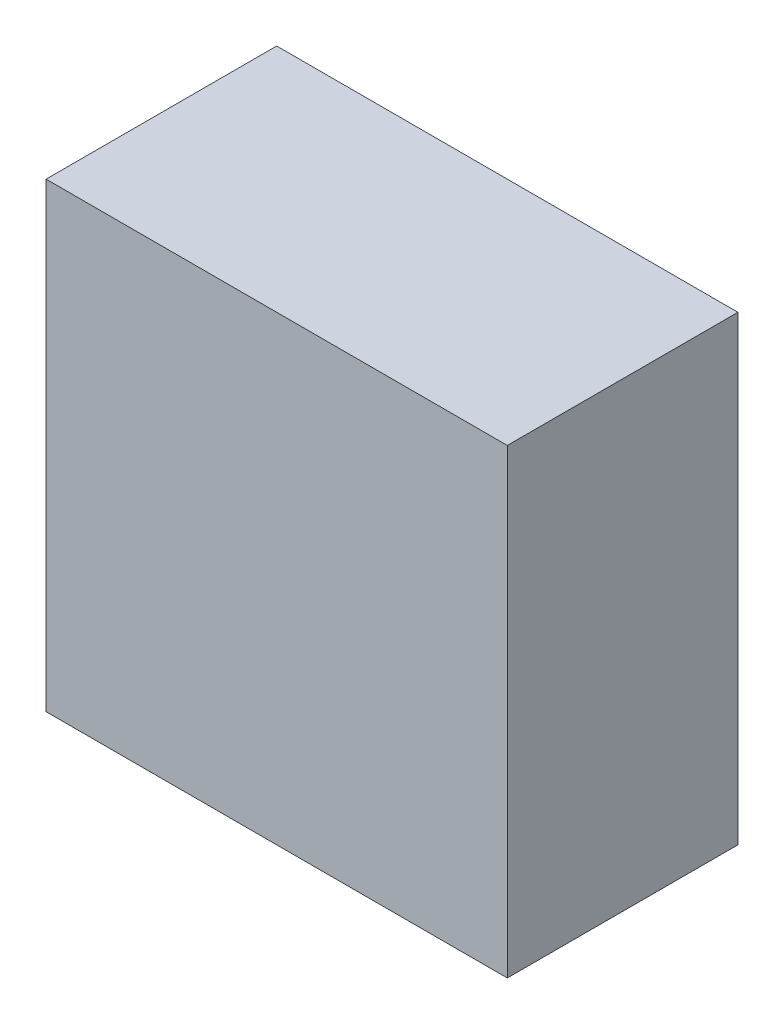
ISO-10303-21;
HEADER;
FILE_DESCRIPTION(('STEP AP214'),'2;1');
FILE_NAME('part.step','',(''),(''),'','','');
FILE_SCHEMA(('AUTOMOTIVE_DESIGN { 1 0 10303 214 1 1 1 1 }'));
ENDSEC;
DATA;
#1=APPLICATION_CONTEXT('core data for automotive mechanical design processes');
#2=APPLICATION_PROTOCOL_DEFINITION('international standard','automotive_design',2000,#1);
#3=PRODUCT_CONTEXT('',#1,'mechanical');
#4=PRODUCT('Part','Part','',(#3));
#5=PRODUCT_RELATED_PRODUCT_CATEGORY('part','',(#4));
#6=PRODUCT_DEFINITION_FORMATION('','',#4);
#7=PRODUCT_DEFINITION_CONTEXT('part definition',#1,'design');
#8=PRODUCT_DEFINITION('design','',#6,#7);
#9=PRODUCT_DEFINITION_SHAPE('','',#8);
#10=(LENGTH_UNIT() NAMED_UNIT(*) SI_UNIT(.MILLI.,.METRE.));
#11=(NAMED_UNIT(*) PLANE_ANGLE_UNIT() SI_UNIT($,.RADIAN.));
#12=(NAMED_UNIT(*) SI_UNIT($,.STERADIAN.) SOLID_ANGLE_UNIT());
#13=UNCERTAINTY_MEASURE_WITH_UNIT(LENGTH_MEASURE(1.E-05),#10,'distance_accuracy_value','');
#14=(GEOMETRIC_REPRESENTATION_CONTEXT(3) GLOBAL_UNCERTAINTY_ASSIGNED_CONTEXT((#13)) GLOBAL_UNIT_ASSIGNED_CONTEXT((#10,
#11,#12)) REPRESENTATION_CONTEXT('',''));
#15=CARTESIAN_POINT('',(0.,0.,0.));
#16=DIRECTION('',(0.,0.,1.));
#17=DIRECTION('',(1.,0.,0.));
#18=AXIS2_PLACEMENT_3D('',#15,#16,#17);
#19=CARTESIAN_POINT('',(0.,0.,1524.));
#20=DIRECTION('',(1.,0.,0.));
#21=DIRECTION('',(0.,0.,-1.));
#22=AXIS2_PLACEMENT_3D('',#19,#20,#21);
#23=PLANE('',#22);
#24=DIRECTION('',(0.,-1.,0.));
#25=VECTOR('',#24,1.);
#26=CARTESIAN_POINT('',(0.,0.,0.));
#27=LINE('',#26,#25);
#28=CARTESIAN_POINT('',(0.,3048.,0.));
#29=VERTEX_POINT('',#28);
#30=CARTESIAN_POINT('',(0.,0.,0.));
#31=VERTEX_POINT('',#30);
#32=EDGE_CURVE('E100',#29,#31,#27,.T.);
#33=ORIENTED_EDGE('',*,*,#32,.T.);
#34=DIRECTION('',(0.,0.,-1.));
#35=VECTOR('',#34,1.);
#36=CARTESIAN_POINT('',(0.,0.,1524.));
#37=LINE('',#36,#35);
#38=CARTESIAN_POINT('',(0.,0.,1524.));
#39=VERTEX_POINT('',#38);
#40=EDGE_CURVE('E11',#39,#31,#37,.T.);
#41=ORIENTED_EDGE('',*,*,#40,.F.);
#42=DIRECTION('',(0.,-1.,0.));
#43=VECTOR('',#42,1.);
#44=CARTESIAN_POINT('',(0.,0.,1524.));
#45=LINE('',#44,#43);
#46=CARTESIAN_POINT('',(0.,3048.,1524.));
#47=VERTEX_POINT('',#46);
#48=EDGE_CURVE('E88',#47,#39,#45,.T.);
#49=ORIENTED_EDGE('',*,*,#48,.F.);
#50=DIRECTION('',(0.,0.,-1.));
#51=VECTOR('',#50,1.);
#52=CARTESIAN_POINT('',(0.,3048.,1524.));
#53=LINE('',#52,#51);
#54=EDGE_CURVE('E96',#47,#29,#53,.T.);
#55=ORIENTED_EDGE('',*,*,#54,.T.);
#56=EDGE_LOOP('',(#33,#41,#49,#55));
#57=FACE_BOUND('',#56,.T.);
#58=ADVANCED_FACE('F37',(#57),#23,.F.);
#59=CARTESIAN_POINT('',(0.,0.,1524.));
#60=DIRECTION('',(0.,1.,0.));
#61=DIRECTION('',(0.,0.,1.));
#62=AXIS2_PLACEMENT_3D('',#59,#60,#61);
#63=PLANE('',#62);
#64=DIRECTION('',(1.,0.,0.));
#65=VECTOR('',#64,1.);
#66=CARTESIAN_POINT('',(0.,0.,0.));
#67=LINE('',#66,#65);
#68=CARTESIAN_POINT('',(3048.,0.,0.));
#69=VERTEX_POINT('',#68);
#70=EDGE_CURVE('E92',#31,#69,#67,.T.);
#71=ORIENTED_EDGE('',*,*,#70,.T.);
#72=DIRECTION('',(0.,0.,-1.));
#73=VECTOR('',#72,1.);
#74=CARTESIAN_POINT('',(3048.,0.,1524.));
#75=LINE('',#74,#73);
#76=CARTESIAN_POINT('',(3048.,0.,1524.));
#77=VERTEX_POINT('',#76);
#78=EDGE_CURVE('E45',#77,#69,#75,.T.);
#79=ORIENTED_EDGE('',*,*,#78,.F.);
#80=DIRECTION('',(1.,0.,0.));
#81=VECTOR('',#80,1.);
#82=CARTESIAN_POINT('',(0.,0.,1524.));
#83=LINE('',#82,#81);
#84=EDGE_CURVE('E83',#39,#77,#83,.T.);
#85=ORIENTED_EDGE('',*,*,#84,.F.);
#86=ORIENTED_EDGE('',*,*,#40,.T.);
#87=EDGE_LOOP('',(#71,#79,#85,#86));
#88=FACE_BOUND('',#87,.T.);
#89=ADVANCED_FACE('F91',(#88),#63,.F.);
#90=CARTESIAN_POINT('',(3048.,0.,1524.));
#91=DIRECTION('',(-1.,0.,0.));
#92=DIRECTION('',(0.,0.,1.));
#93=AXIS2_PLACEMENT_3D('',#90,#91,#92);
#94=PLANE('',#93);
#95=DIRECTION('',(0.,1.,0.));
#96=VECTOR('',#95,1.);
#97=CARTESIAN_POINT('',(3048.,0.,0.));
#98=LINE('',#97,#96);
#99=CARTESIAN_POINT('',(3048.,3048.,0.));
#100=VERTEX_POINT('',#99);
#101=EDGE_CURVE('E70',#69,#100,#98,.T.);
#102=ORIENTED_EDGE('',*,*,#101,.T.);
#103=DIRECTION('',(0.,0.,-1.));
#104=VECTOR('',#103,1.);
#105=CARTESIAN_POINT('',(3048.,3048.,1524.));
#106=LINE('',#105,#104);
#107=CARTESIAN_POINT('',(3048.,3048.,1524.));
#108=VERTEX_POINT('',#107);
#109=EDGE_CURVE('E93',#108,#100,#106,.T.);
#110=ORIENTED_EDGE('',*,*,#109,.F.);
#111=DIRECTION('',(0.,1.,0.));
#112=VECTOR('',#111,1.);
#113=CARTESIAN_POINT('',(3048.,0.,1524.));
#114=LINE('',#113,#112);
#115=EDGE_CURVE('E86',#77,#108,#114,.T.);
#116=ORIENTED_EDGE('',*,*,#115,.F.);
#117=ORIENTED_EDGE('',*,*,#78,.T.);
#118=EDGE_LOOP('',(#102,#110,#116,#117));
#119=FACE_BOUND('',#118,.T.);
#120=ADVANCED_FACE('F94',(#119),#94,.F.);
#121=CARTESIAN_POINT('',(0.,3048.,1524.));
#122=DIRECTION('',(0.,-1.,0.));
#123=DIRECTION('',(0.,0.,-1.));
#124=AXIS2_PLACEMENT_3D('',#121,#122,#123);
#125=PLANE('',#124);
#126=DIRECTION('',(-1.,0.,0.));
#127=VECTOR('',#126,1.);
#128=CARTESIAN_POINT('',(0.,3048.,0.));
#129=LINE('',#128,#127);
#130=EDGE_CURVE('E76',#100,#29,#129,.T.);
#131=ORIENTED_EDGE('',*,*,#130,.T.);
#132=ORIENTED_EDGE('',*,*,#54,.F.);
#133=DIRECTION('',(-1.,0.,0.));
#134=VECTOR('',#133,1.);
#135=CARTESIAN_POINT('',(0.,3048.,1524.));
#136=LINE('',#135,#134);
#137=EDGE_CURVE('E53',#108,#47,#136,.T.);
#138=ORIENTED_EDGE('',*,*,#137,.F.);
#139=ORIENTED_EDGE('',*,*,#109,.T.);
#140=EDGE_LOOP('',(#131,#132,#138,#139));
#141=FACE_BOUND('',#140,.T.);
#142=ADVANCED_FACE('F107',(#141),#125,.F.);
#143=CARTESIAN_POINT('',(0.,0.,1524.));
#144=DIRECTION('',(0.,0.,-1.));
#145=DIRECTION('',(-1.,0.,0.));
#146=AXIS2_PLACEMENT_3D('',#143,#144,#145);
#147=PLANE('',#146);
#148=ORIENTED_EDGE('',*,*,#48,.T.);
#149=ORIENTED_EDGE('',*,*,#84,.T.);
#150=ORIENTED_EDGE('',*,*,#115,.T.);
#151=ORIENTED_EDGE('',*,*,#137,.T.);
#152=EDGE_LOOP('',(#148,#149,#150,#151));
#153=FACE_BOUND('',#152,.T.);
#154=ADVANCED_FACE('F84',(#153),#147,.F.);
#155=CARTESIAN_POINT('',(0.,0.,0.));
#156=DIRECTION('',(0.,0.,-1.));
#157=DIRECTION('',(-1.,0.,0.));
#158=AXIS2_PLACEMENT_3D('',#155,#156,#157);
#159=PLANE('',#158);
#160=ORIENTED_EDGE('',*,*,#32,.F.);
#161=ORIENTED_EDGE('',*,*,#130,.F.);
#162=ORIENTED_EDGE('',*,*,#101,.F.);
#163=ORIENTED_EDGE('',*,*,#70,.F.);
#164=EDGE_LOOP('',(#160,#161,#162,#163));
#165=FACE_BOUND('',#164,.T.);
#166=ADVANCED_FACE('F110',(#165),#159,.T.);
#167=CLOSED_SHELL('',(#58,#89,#120,#142,#154,#166));
#168=MANIFOLD_SOLID_BREP('B2',#167);
#169=ADVANCED_BREP_SHAPE_REPRESENTATION('',(#18,#168),#14);
#170=SHAPE_DEFINITION_REPRESENTATION(#9,#169);
ENDSEC;
END-ISO-10303-21;
